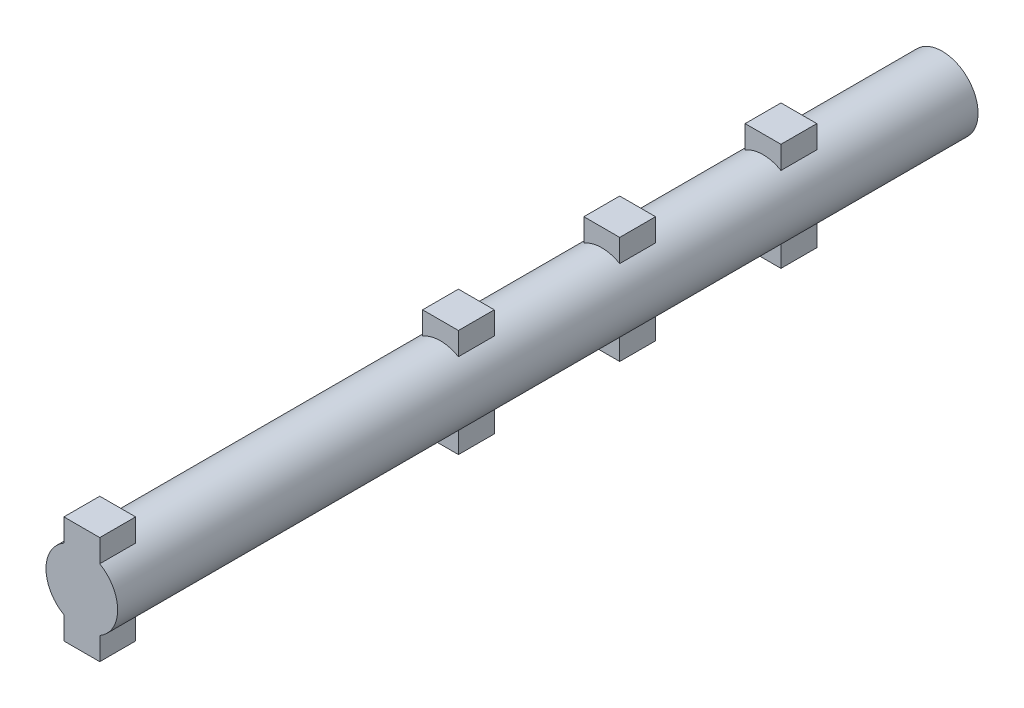
ISO-10303-21;
HEADER;
FILE_DESCRIPTION(('STEP AP214'),'2;1');
FILE_NAME('part.step','',(''),(''),'','','');
FILE_SCHEMA(('AUTOMOTIVE_DESIGN { 1 0 10303 214 1 1 1 1 }'));
ENDSEC;
DATA;
#1=APPLICATION_CONTEXT('core data for automotive mechanical design processes');
#2=APPLICATION_PROTOCOL_DEFINITION('international standard','automotive_design',2000,#1);
#3=PRODUCT_CONTEXT('',#1,'mechanical');
#4=PRODUCT('Part','Part','',(#3));
#5=PRODUCT_RELATED_PRODUCT_CATEGORY('part','',(#4));
#6=PRODUCT_DEFINITION_FORMATION('','',#4);
#7=PRODUCT_DEFINITION_CONTEXT('part definition',#1,'design');
#8=PRODUCT_DEFINITION('design','',#6,#7);
#9=PRODUCT_DEFINITION_SHAPE('','',#8);
#10=(LENGTH_UNIT() NAMED_UNIT(*) SI_UNIT(.MILLI.,.METRE.));
#11=(NAMED_UNIT(*) PLANE_ANGLE_UNIT() SI_UNIT($,.RADIAN.));
#12=(NAMED_UNIT(*) SI_UNIT($,.STERADIAN.) SOLID_ANGLE_UNIT());
#13=UNCERTAINTY_MEASURE_WITH_UNIT(LENGTH_MEASURE(1.E-05),#10,'distance_accuracy_value','');
#14=(GEOMETRIC_REPRESENTATION_CONTEXT(3) GLOBAL_UNCERTAINTY_ASSIGNED_CONTEXT((#13)) GLOBAL_UNIT_ASSIGNED_CONTEXT((#10,
#11,#12)) REPRESENTATION_CONTEXT('',''));
#15=CARTESIAN_POINT('',(0.,0.,0.));
#16=DIRECTION('',(0.,0.,1.));
#17=DIRECTION('',(1.,0.,0.));
#18=AXIS2_PLACEMENT_3D('',#15,#16,#17);
#19=CARTESIAN_POINT('',(0.,0.,25.));
#20=DIRECTION('',(0.,0.,1.));
#21=DIRECTION('',(1.,0.,0.));
#22=AXIS2_PLACEMENT_3D('',#19,#20,#21);
#23=PLANE('',#22);
#24=CARTESIAN_POINT('',(0.,0.,25.));
#25=DIRECTION('',(0.,0.,1.));
#26=DIRECTION('',(1.,0.,0.));
#27=AXIS2_PLACEMENT_3D('',#24,#25,#26);
#28=CIRCLE('',#27,5.);
#29=CARTESIAN_POINT('',(2.5,4.33012701892219,25.));
#30=VERTEX_POINT('',#29);
#31=CARTESIAN_POINT('',(-2.5,4.33012701892219,25.));
#32=VERTEX_POINT('',#31);
#33=EDGE_CURVE('E325',#30,#32,#28,.T.);
#34=ORIENTED_EDGE('',*,*,#33,.F.);
#35=DIRECTION('',(0.,1.,0.));
#36=VECTOR('',#35,1.);
#37=CARTESIAN_POINT('',(2.5,-7.5,25.));
#38=LINE('',#37,#36);
#39=CARTESIAN_POINT('',(2.5,7.5,25.));
#40=VERTEX_POINT('',#39);
#41=EDGE_CURVE('E476',#30,#40,#38,.T.);
#42=ORIENTED_EDGE('',*,*,#41,.T.);
#43=DIRECTION('',(-1.,0.,0.));
#44=VECTOR('',#43,1.);
#45=CARTESIAN_POINT('',(-2.5,7.5,25.));
#46=LINE('',#45,#44);
#47=CARTESIAN_POINT('',(-2.5,7.5,25.));
#48=VERTEX_POINT('',#47);
#49=EDGE_CURVE('E499',#40,#48,#46,.T.);
#50=ORIENTED_EDGE('',*,*,#49,.T.);
#51=DIRECTION('',(0.,-1.,0.));
#52=VECTOR('',#51,1.);
#53=CARTESIAN_POINT('',(-2.5,-7.5,25.));
#54=LINE('',#53,#52);
#55=EDGE_CURVE('E504',#48,#32,#54,.T.);
#56=ORIENTED_EDGE('',*,*,#55,.T.);
#57=EDGE_LOOP('',(#34,#42,#50,#56));
#58=FACE_BOUND('',#57,.T.);
#59=ADVANCED_FACE('F40',(#58),#23,.T.);
#60=CARTESIAN_POINT('',(0.,0.,-25.));
#61=DIRECTION('',(0.,0.,-1.));
#62=DIRECTION('',(-1.,0.,0.));
#63=AXIS2_PLACEMENT_3D('',#60,#61,#62);
#64=PLANE('',#63);
#65=CARTESIAN_POINT('',(0.,0.,-25.));
#66=DIRECTION('',(0.,0.,-1.));
#67=DIRECTION('',(-1.,0.,0.));
#68=AXIS2_PLACEMENT_3D('',#65,#66,#67);
#69=CIRCLE('',#68,5.);
#70=CARTESIAN_POINT('',(-2.5,4.33012701892219,-25.));
#71=VERTEX_POINT('',#70);
#72=CARTESIAN_POINT('',(2.5,4.33012701892219,-25.));
#73=VERTEX_POINT('',#72);
#74=EDGE_CURVE('E339',#71,#73,#69,.T.);
#75=ORIENTED_EDGE('',*,*,#74,.F.);
#76=DIRECTION('',(0.,1.,0.));
#77=VECTOR('',#76,1.);
#78=CARTESIAN_POINT('',(-2.5,-7.5,-25.));
#79=LINE('',#78,#77);
#80=CARTESIAN_POINT('',(-2.5,7.5,-25.));
#81=VERTEX_POINT('',#80);
#82=EDGE_CURVE('E378',#71,#81,#79,.T.);
#83=ORIENTED_EDGE('',*,*,#82,.T.);
#84=DIRECTION('',(1.,0.,0.));
#85=VECTOR('',#84,1.);
#86=CARTESIAN_POINT('',(-2.5,7.5,-25.));
#87=LINE('',#86,#85);
#88=CARTESIAN_POINT('',(2.5,7.5,-25.));
#89=VERTEX_POINT('',#88);
#90=EDGE_CURVE('E382',#81,#89,#87,.T.);
#91=ORIENTED_EDGE('',*,*,#90,.T.);
#92=DIRECTION('',(0.,-1.,0.));
#93=VECTOR('',#92,1.);
#94=CARTESIAN_POINT('',(2.5,-7.5,-25.));
#95=LINE('',#94,#93);
#96=EDGE_CURVE('E371',#89,#73,#95,.T.);
#97=ORIENTED_EDGE('',*,*,#96,.T.);
#98=EDGE_LOOP('',(#75,#83,#91,#97));
#99=FACE_BOUND('',#98,.T.);
#100=ADVANCED_FACE('F617',(#99),#64,.T.);
#101=CARTESIAN_POINT('',(2.5,-7.5,2.5));
#102=DIRECTION('',(1.,0.,0.));
#103=DIRECTION('',(0.,0.,-1.));
#104=AXIS2_PLACEMENT_3D('',#101,#102,#103);
#105=PLANE('',#104);
#106=DIRECTION('',(0.,0.,-1.));
#107=VECTOR('',#106,1.);
#108=CARTESIAN_POINT('',(2.5,4.33012701892219,25.));
#109=LINE('',#108,#107);
#110=CARTESIAN_POINT('',(2.5,4.33012701892219,-2.5));
#111=VERTEX_POINT('',#110);
#112=CARTESIAN_POINT('',(2.5,4.33012701892219,2.5));
#113=VERTEX_POINT('',#112);
#114=EDGE_CURVE('E454',#111,#113,#109,.F.);
#115=ORIENTED_EDGE('',*,*,#114,.F.);
#116=DIRECTION('',(0.,-1.,0.));
#117=VECTOR('',#116,1.);
#118=CARTESIAN_POINT('',(2.5,-7.5,-2.5));
#119=LINE('',#118,#117);
#120=CARTESIAN_POINT('',(2.5,7.5,-2.5));
#121=VERTEX_POINT('',#120);
#122=EDGE_CURVE('E424',#121,#111,#119,.T.);
#123=ORIENTED_EDGE('',*,*,#122,.F.);
#124=DIRECTION('',(0.,0.,-1.));
#125=VECTOR('',#124,1.);
#126=CARTESIAN_POINT('',(2.5,7.5,2.5));
#127=LINE('',#126,#125);
#128=CARTESIAN_POINT('',(2.5,7.5,2.5));
#129=VERTEX_POINT('',#128);
#130=EDGE_CURVE('E459',#129,#121,#127,.T.);
#131=ORIENTED_EDGE('',*,*,#130,.F.);
#132=DIRECTION('',(0.,-1.,0.));
#133=VECTOR('',#132,1.);
#134=CARTESIAN_POINT('',(2.5,-7.5,2.5));
#135=LINE('',#134,#133);
#136=EDGE_CURVE('E442',#129,#113,#135,.T.);
#137=ORIENTED_EDGE('',*,*,#136,.T.);
#138=EDGE_LOOP('',(#115,#123,#131,#137));
#139=FACE_BOUND('',#138,.T.);
#140=ADVANCED_FACE('F623',(#139),#105,.T.);
#141=CARTESIAN_POINT('',(2.5,-4.33012701892219,-2.5));
#142=VERTEX_POINT('',#141);
#143=CARTESIAN_POINT('',(2.5,-7.5,-2.5));
#144=VERTEX_POINT('',#143);
#145=EDGE_CURVE('E423',#142,#144,#119,.T.);
#146=ORIENTED_EDGE('',*,*,#145,.F.);
#147=DIRECTION('',(0.,0.,-1.));
#148=VECTOR('',#147,1.);
#149=CARTESIAN_POINT('',(2.5,-4.33012701892219,25.));
#150=LINE('',#149,#148);
#151=CARTESIAN_POINT('',(2.5,-4.33012701892219,2.5));
#152=VERTEX_POINT('',#151);
#153=EDGE_CURVE('E467',#152,#142,#150,.T.);
#154=ORIENTED_EDGE('',*,*,#153,.F.);
#155=CARTESIAN_POINT('',(2.5,-7.5,2.5));
#156=VERTEX_POINT('',#155);
#157=EDGE_CURVE('E441',#152,#156,#135,.T.);
#158=ORIENTED_EDGE('',*,*,#157,.T.);
#159=DIRECTION('',(0.,0.,-1.));
#160=VECTOR('',#159,1.);
#161=CARTESIAN_POINT('',(2.5,-7.5,2.5));
#162=LINE('',#161,#160);
#163=EDGE_CURVE('E455',#156,#144,#162,.T.);
#164=ORIENTED_EDGE('',*,*,#163,.T.);
#165=EDGE_LOOP('',(#146,#154,#158,#164));
#166=FACE_BOUND('',#165,.T.);
#167=ADVANCED_FACE('F572',(#166),#105,.T.);
#168=CARTESIAN_POINT('',(-2.5,-7.5,2.5));
#169=DIRECTION('',(-1.,0.,0.));
#170=DIRECTION('',(0.,0.,1.));
#171=AXIS2_PLACEMENT_3D('',#168,#169,#170);
#172=PLANE('',#171);
#173=DIRECTION('',(0.,0.,-1.));
#174=VECTOR('',#173,1.);
#175=CARTESIAN_POINT('',(-2.5,-4.33012701892219,25.));
#176=LINE('',#175,#174);
#177=CARTESIAN_POINT('',(-2.5,-4.33012701892219,-2.5));
#178=VERTEX_POINT('',#177);
#179=CARTESIAN_POINT('',(-2.5,-4.33012701892219,2.5));
#180=VERTEX_POINT('',#179);
#181=EDGE_CURVE('E470',#178,#180,#176,.F.);
#182=ORIENTED_EDGE('',*,*,#181,.F.);
#183=DIRECTION('',(0.,1.,0.));
#184=VECTOR('',#183,1.);
#185=CARTESIAN_POINT('',(-2.5,-7.5,-2.5));
#186=LINE('',#185,#184);
#187=CARTESIAN_POINT('',(-2.5,-7.5,-2.5));
#188=VERTEX_POINT('',#187);
#189=EDGE_CURVE('E415',#188,#178,#186,.T.);
#190=ORIENTED_EDGE('',*,*,#189,.F.);
#191=DIRECTION('',(0.,0.,-1.));
#192=VECTOR('',#191,1.);
#193=CARTESIAN_POINT('',(-2.5,-7.5,2.5));
#194=LINE('',#193,#192);
#195=CARTESIAN_POINT('',(-2.5,-7.5,2.5));
#196=VERTEX_POINT('',#195);
#197=EDGE_CURVE('E451',#196,#188,#194,.T.);
#198=ORIENTED_EDGE('',*,*,#197,.F.);
#199=DIRECTION('',(0.,1.,0.));
#200=VECTOR('',#199,1.);
#201=CARTESIAN_POINT('',(-2.5,-7.5,2.5));
#202=LINE('',#201,#200);
#203=EDGE_CURVE('E433',#196,#180,#202,.T.);
#204=ORIENTED_EDGE('',*,*,#203,.T.);
#205=EDGE_LOOP('',(#182,#190,#198,#204));
#206=FACE_BOUND('',#205,.T.);
#207=ADVANCED_FACE('F724',(#206),#172,.T.);
#208=CARTESIAN_POINT('',(-2.5,4.33012701892219,-2.5));
#209=VERTEX_POINT('',#208);
#210=CARTESIAN_POINT('',(-2.5,7.5,-2.5));
#211=VERTEX_POINT('',#210);
#212=EDGE_CURVE('E414',#209,#211,#186,.T.);
#213=ORIENTED_EDGE('',*,*,#212,.F.);
#214=DIRECTION('',(0.,0.,-1.));
#215=VECTOR('',#214,1.);
#216=CARTESIAN_POINT('',(-2.5,4.33012701892219,25.));
#217=LINE('',#216,#215);
#218=CARTESIAN_POINT('',(-2.5,4.33012701892219,2.5));
#219=VERTEX_POINT('',#218);
#220=EDGE_CURVE('E473',#219,#209,#217,.T.);
#221=ORIENTED_EDGE('',*,*,#220,.F.);
#222=CARTESIAN_POINT('',(-2.5,7.5,2.5));
#223=VERTEX_POINT('',#222);
#224=EDGE_CURVE('E432',#219,#223,#202,.T.);
#225=ORIENTED_EDGE('',*,*,#224,.T.);
#226=DIRECTION('',(0.,0.,-1.));
#227=VECTOR('',#226,1.);
#228=CARTESIAN_POINT('',(-2.5,7.5,2.5));
#229=LINE('',#228,#227);
#230=EDGE_CURVE('E450',#223,#211,#229,.T.);
#231=ORIENTED_EDGE('',*,*,#230,.T.);
#232=EDGE_LOOP('',(#213,#221,#225,#231));
#233=FACE_BOUND('',#232,.T.);
#234=ADVANCED_FACE('F695',(#233),#172,.T.);
#235=CARTESIAN_POINT('',(0.,0.,-2.5));
#236=DIRECTION('',(0.,0.,1.));
#237=DIRECTION('',(1.,0.,0.));
#238=AXIS2_PLACEMENT_3D('',#235,#236,#237);
#239=PLANE('',#238);
#240=CARTESIAN_POINT('',(0.,0.,-2.5));
#241=DIRECTION('',(0.,0.,1.));
#242=DIRECTION('',(1.,0.,0.));
#243=AXIS2_PLACEMENT_3D('',#240,#241,#242);
#244=CIRCLE('',#243,5.);
#245=EDGE_CURVE('E551',#142,#178,#244,.F.);
#246=ORIENTED_EDGE('',*,*,#245,.F.);
#247=ORIENTED_EDGE('',*,*,#145,.T.);
#248=DIRECTION('',(-1.,0.,0.));
#249=VECTOR('',#248,1.);
#250=CARTESIAN_POINT('',(2.5,-7.5,-2.5));
#251=LINE('',#250,#249);
#252=EDGE_CURVE('E428',#144,#188,#251,.T.);
#253=ORIENTED_EDGE('',*,*,#252,.T.);
#254=ORIENTED_EDGE('',*,*,#189,.T.);
#255=EDGE_LOOP('',(#246,#247,#253,#254));
#256=FACE_BOUND('',#255,.T.);
#257=ADVANCED_FACE('F569',(#256),#239,.F.);
#258=CARTESIAN_POINT('',(0.,0.,25.));
#259=DIRECTION('',(0.,0.,-1.));
#260=DIRECTION('',(-1.,0.,0.));
#261=AXIS2_PLACEMENT_3D('',#258,#259,#260);
#262=CYLINDRICAL_SURFACE('',#261,5.);
#263=CARTESIAN_POINT('',(0.,0.,70.0439507198228));
#264=DIRECTION('',(0.,0.,1.));
#265=DIRECTION('',(1.,0.,0.));
#266=AXIS2_PLACEMENT_3D('',#263,#264,#265);
#267=CIRCLE('',#266,5.);
#268=CARTESIAN_POINT('',(2.5,4.33012701892219,70.0439507198228));
#269=VERTEX_POINT('',#268);
#270=CARTESIAN_POINT('',(-2.5,4.33012701892219,70.0439507198228));
#271=VERTEX_POINT('',#270);
#272=EDGE_CURVE('E11',#269,#271,#267,.T.);
#273=ORIENTED_EDGE('',*,*,#272,.F.);
#274=DIRECTION('',(0.,0.,-1.));
#275=VECTOR('',#274,1.);
#276=CARTESIAN_POINT('',(2.5,4.33012701892219,25.));
#277=LINE('',#276,#275);
#278=CARTESIAN_POINT('',(2.5,4.3301270189222,75.0439507198228));
#279=VERTEX_POINT('',#278);
#280=EDGE_CURVE('E259',#269,#279,#277,.F.);
#281=ORIENTED_EDGE('',*,*,#280,.T.);
#282=CARTESIAN_POINT('',(0.,0.,75.0439507198228));
#283=DIRECTION('',(0.,0.,1.));
#284=DIRECTION('',(1.,0.,0.));
#285=AXIS2_PLACEMENT_3D('',#282,#283,#284);
#286=CIRCLE('',#285,5.);
#287=CARTESIAN_POINT('',(2.5,-4.3301270189222,75.0439507198228));
#288=VERTEX_POINT('',#287);
#289=EDGE_CURVE('E326',#288,#279,#286,.T.);
#290=ORIENTED_EDGE('',*,*,#289,.F.);
#291=DIRECTION('',(0.,0.,-1.));
#292=VECTOR('',#291,1.);
#293=CARTESIAN_POINT('',(2.5,-4.33012701892219,25.));
#294=LINE('',#293,#292);
#295=CARTESIAN_POINT('',(2.5,-4.33012701892219,70.0439507198228));
#296=VERTEX_POINT('',#295);
#297=EDGE_CURVE('E321',#288,#296,#294,.T.);
#298=ORIENTED_EDGE('',*,*,#297,.T.);
#299=CARTESIAN_POINT('',(-2.5,-4.33012701892219,70.0439507198228));
#300=VERTEX_POINT('',#299);
#301=EDGE_CURVE('E44',#300,#296,#267,.T.);
#302=ORIENTED_EDGE('',*,*,#301,.F.);
#303=DIRECTION('',(0.,0.,-1.));
#304=VECTOR('',#303,1.);
#305=CARTESIAN_POINT('',(-2.5,-4.33012701892219,25.));
#306=LINE('',#305,#304);
#307=CARTESIAN_POINT('',(-2.5,-4.3301270189222,75.0439507198228));
#308=VERTEX_POINT('',#307);
#309=EDGE_CURVE('E305',#300,#308,#306,.F.);
#310=ORIENTED_EDGE('',*,*,#309,.T.);
#311=CARTESIAN_POINT('',(-2.5,4.3301270189222,75.0439507198228));
#312=VERTEX_POINT('',#311);
#313=EDGE_CURVE('E329',#312,#308,#286,.T.);
#314=ORIENTED_EDGE('',*,*,#313,.F.);
#315=DIRECTION('',(0.,0.,-1.));
#316=VECTOR('',#315,1.);
#317=CARTESIAN_POINT('',(-2.5,4.33012701892219,25.));
#318=LINE('',#317,#316);
#319=EDGE_CURVE('E315',#312,#271,#318,.T.);
#320=ORIENTED_EDGE('',*,*,#319,.T.);
#321=EDGE_LOOP('',(#273,#281,#290,#298,#302,#310,#314,#320));
#322=FACE_BOUND('',#321,.T.);
#323=DIRECTION('',(0.,0.,-1.));
#324=VECTOR('',#323,1.);
#325=CARTESIAN_POINT('',(-2.5,-4.33012701892219,25.));
#326=LINE('',#325,#324);
#327=CARTESIAN_POINT('',(-2.5,-4.33012701892219,20.));
#328=VERTEX_POINT('',#327);
#329=CARTESIAN_POINT('',(-2.5,-4.33012701892219,25.));
#330=VERTEX_POINT('',#329);
#331=EDGE_CURVE('E514',#328,#330,#326,.F.);
#332=ORIENTED_EDGE('',*,*,#331,.T.);
#333=CARTESIAN_POINT('',(2.5,-4.33012701892219,25.));
#334=VERTEX_POINT('',#333);
#335=EDGE_CURVE('E333',#330,#334,#28,.T.);
#336=ORIENTED_EDGE('',*,*,#335,.T.);
#337=DIRECTION('',(0.,0.,-1.));
#338=VECTOR('',#337,1.);
#339=CARTESIAN_POINT('',(2.5,-4.33012701892219,25.));
#340=LINE('',#339,#338);
#341=CARTESIAN_POINT('',(2.5,-4.33012701892219,20.));
#342=VERTEX_POINT('',#341);
#343=EDGE_CURVE('E535',#334,#342,#340,.T.);
#344=ORIENTED_EDGE('',*,*,#343,.T.);
#345=CARTESIAN_POINT('',(0.,0.,20.));
#346=DIRECTION('',(0.,0.,-1.));
#347=DIRECTION('',(-1.,0.,0.));
#348=AXIS2_PLACEMENT_3D('',#345,#346,#347);
#349=CIRCLE('',#348,5.);
#350=EDGE_CURVE('E539',#342,#328,#349,.T.);
#351=ORIENTED_EDGE('',*,*,#350,.T.);
#352=EDGE_LOOP('',(#332,#336,#344,#351));
#353=FACE_BOUND('',#352,.T.);
#354=DIRECTION('',(0.,0.,-1.));
#355=VECTOR('',#354,1.);
#356=CARTESIAN_POINT('',(2.5,-4.33012701892219,25.));
#357=LINE('',#356,#355);
#358=CARTESIAN_POINT('',(2.5,-4.33012701892219,-20.));
#359=VERTEX_POINT('',#358);
#360=CARTESIAN_POINT('',(2.5,-4.33012701892219,-25.));
#361=VERTEX_POINT('',#360);
#362=EDGE_CURVE('E410',#359,#361,#357,.T.);
#363=ORIENTED_EDGE('',*,*,#362,.T.);
#364=CARTESIAN_POINT('',(-2.5,-4.33012701892219,-25.));
#365=VERTEX_POINT('',#364);
#366=EDGE_CURVE('E344',#361,#365,#69,.T.);
#367=ORIENTED_EDGE('',*,*,#366,.T.);
#368=DIRECTION('',(0.,0.,-1.));
#369=VECTOR('',#368,1.);
#370=CARTESIAN_POINT('',(-2.5,-4.33012701892219,25.));
#371=LINE('',#370,#369);
#372=CARTESIAN_POINT('',(-2.5,-4.33012701892219,-20.));
#373=VERTEX_POINT('',#372);
#374=EDGE_CURVE('E389',#365,#373,#371,.F.);
#375=ORIENTED_EDGE('',*,*,#374,.T.);
#376=CARTESIAN_POINT('',(0.,0.,-20.));
#377=DIRECTION('',(0.,0.,-1.));
#378=DIRECTION('',(-1.,0.,0.));
#379=AXIS2_PLACEMENT_3D('',#376,#377,#378);
#380=CIRCLE('',#379,5.);
#381=EDGE_CURVE('E552',#359,#373,#380,.T.);
#382=ORIENTED_EDGE('',*,*,#381,.F.);
#383=EDGE_LOOP('',(#363,#367,#375,#382));
#384=FACE_BOUND('',#383,.T.);
#385=ORIENTED_EDGE('',*,*,#74,.T.);
#386=DIRECTION('',(0.,0.,-1.));
#387=VECTOR('',#386,1.);
#388=CARTESIAN_POINT('',(2.5,4.33012701892219,25.));
#389=LINE('',#388,#387);
#390=CARTESIAN_POINT('',(2.5,4.33012701892219,-20.));
#391=VERTEX_POINT('',#390);
#392=EDGE_CURVE('E406',#73,#391,#389,.F.);
#393=ORIENTED_EDGE('',*,*,#392,.T.);
#394=CARTESIAN_POINT('',(-2.5,4.33012701892219,-20.));
#395=VERTEX_POINT('',#394);
#396=EDGE_CURVE('E554',#395,#391,#380,.T.);
#397=ORIENTED_EDGE('',*,*,#396,.F.);
#398=DIRECTION('',(0.,0.,-1.));
#399=VECTOR('',#398,1.);
#400=CARTESIAN_POINT('',(-2.5,4.33012701892219,25.));
#401=LINE('',#400,#399);
#402=EDGE_CURVE('E403',#395,#71,#401,.T.);
#403=ORIENTED_EDGE('',*,*,#402,.T.);
#404=EDGE_LOOP('',(#385,#393,#397,#403));
#405=FACE_BOUND('',#404,.T.);
#406=EDGE_CURVE('E548',#209,#111,#244,.F.);
#407=ORIENTED_EDGE('',*,*,#406,.T.);
#408=ORIENTED_EDGE('',*,*,#114,.T.);
#409=CARTESIAN_POINT('',(0.,0.,2.5));
#410=DIRECTION('',(0.,0.,1.));
#411=DIRECTION('',(1.,0.,0.));
#412=AXIS2_PLACEMENT_3D('',#409,#410,#411);
#413=CIRCLE('',#412,5.);
#414=EDGE_CURVE('E547',#113,#219,#413,.T.);
#415=ORIENTED_EDGE('',*,*,#414,.T.);
#416=ORIENTED_EDGE('',*,*,#220,.T.);
#417=EDGE_LOOP('',(#407,#408,#415,#416));
#418=FACE_BOUND('',#417,.T.);
#419=ORIENTED_EDGE('',*,*,#153,.T.);
#420=ORIENTED_EDGE('',*,*,#245,.T.);
#421=ORIENTED_EDGE('',*,*,#181,.T.);
#422=EDGE_CURVE('E544',#180,#152,#413,.T.);
#423=ORIENTED_EDGE('',*,*,#422,.T.);
#424=EDGE_LOOP('',(#419,#420,#421,#423));
#425=FACE_BOUND('',#424,.T.);
#426=CARTESIAN_POINT('',(-2.5,4.33012701892219,20.));
#427=VERTEX_POINT('',#426);
#428=CARTESIAN_POINT('',(2.5,4.33012701892219,20.));
#429=VERTEX_POINT('',#428);
#430=EDGE_CURVE('E543',#427,#429,#349,.T.);
#431=ORIENTED_EDGE('',*,*,#430,.T.);
#432=DIRECTION('',(0.,0.,-1.));
#433=VECTOR('',#432,1.);
#434=CARTESIAN_POINT('',(2.5,4.33012701892219,25.));
#435=LINE('',#434,#433);
#436=EDGE_CURVE('E532',#429,#30,#435,.F.);
#437=ORIENTED_EDGE('',*,*,#436,.T.);
#438=ORIENTED_EDGE('',*,*,#33,.T.);
#439=DIRECTION('',(0.,0.,-1.));
#440=VECTOR('',#439,1.);
#441=CARTESIAN_POINT('',(-2.5,4.33012701892219,25.));
#442=LINE('',#441,#440);
#443=EDGE_CURVE('E528',#32,#427,#442,.T.);
#444=ORIENTED_EDGE('',*,*,#443,.T.);
#445=EDGE_LOOP('',(#431,#437,#438,#444));
#446=FACE_BOUND('',#445,.T.);
#447=CARTESIAN_POINT('',(0.,0.,-45.));
#448=DIRECTION('',(0.,0.,-1.));
#449=DIRECTION('',(-1.,0.,0.));
#450=AXIS2_PLACEMENT_3D('',#447,#448,#449);
#451=CIRCLE('',#450,5.);
#452=CARTESIAN_POINT('',(-5.,0.,-45.));
#453=VERTEX_POINT('',#452);
#454=EDGE_CURVE('E334',#453,#453,#451,.T.);
#455=ORIENTED_EDGE('',*,*,#454,.F.);
#456=EDGE_LOOP('',(#455));
#457=FACE_BOUND('',#456,.T.);
#458=ADVANCED_FACE('F42',(#322,#353,#384,#405,#418,#425,#446,#457),#262,.T.);
#459=ORIENTED_EDGE('',*,*,#335,.F.);
#460=CARTESIAN_POINT('',(-2.5,-7.5,25.));
#461=VERTEX_POINT('',#460);
#462=EDGE_CURVE('E503',#330,#461,#54,.T.);
#463=ORIENTED_EDGE('',*,*,#462,.T.);
#464=DIRECTION('',(1.,0.,0.));
#465=VECTOR('',#464,1.);
#466=CARTESIAN_POINT('',(-2.5,-7.5,25.));
#467=LINE('',#466,#465);
#468=CARTESIAN_POINT('',(2.5,-7.5,25.));
#469=VERTEX_POINT('',#468);
#470=EDGE_CURVE('E507',#461,#469,#467,.T.);
#471=ORIENTED_EDGE('',*,*,#470,.T.);
#472=EDGE_CURVE('E496',#469,#334,#38,.T.);
#473=ORIENTED_EDGE('',*,*,#472,.T.);
#474=EDGE_LOOP('',(#459,#463,#471,#473));
#475=FACE_BOUND('',#474,.T.);
#476=ADVANCED_FACE('F619',(#475),#23,.T.);
#477=CARTESIAN_POINT('',(-2.5,-7.5,20.));
#478=DIRECTION('',(0.,-1.,0.));
#479=DIRECTION('',(0.,0.,-1.));
#480=AXIS2_PLACEMENT_3D('',#477,#478,#479);
#481=PLANE('',#480);
#482=ORIENTED_EDGE('',*,*,#470,.F.);
#483=DIRECTION('',(0.,0.,1.));
#484=VECTOR('',#483,1.);
#485=CARTESIAN_POINT('',(-2.5,-7.5,20.));
#486=LINE('',#485,#484);
#487=CARTESIAN_POINT('',(-2.5,-7.5,20.));
#488=VERTEX_POINT('',#487);
#489=EDGE_CURVE('E515',#488,#461,#486,.T.);
#490=ORIENTED_EDGE('',*,*,#489,.F.);
#491=DIRECTION('',(1.,0.,0.));
#492=VECTOR('',#491,1.);
#493=CARTESIAN_POINT('',(-2.5,-7.5,20.));
#494=LINE('',#493,#492);
#495=CARTESIAN_POINT('',(2.5,-7.5,20.));
#496=VERTEX_POINT('',#495);
#497=EDGE_CURVE('E491',#488,#496,#494,.T.);
#498=ORIENTED_EDGE('',*,*,#497,.T.);
#499=DIRECTION('',(0.,0.,1.));
#500=VECTOR('',#499,1.);
#501=CARTESIAN_POINT('',(2.5,-7.5,20.));
#502=LINE('',#501,#500);
#503=EDGE_CURVE('E511',#496,#469,#502,.T.);
#504=ORIENTED_EDGE('',*,*,#503,.T.);
#505=EDGE_LOOP('',(#482,#490,#498,#504));
#506=FACE_BOUND('',#505,.T.);
#507=ADVANCED_FACE('F630',(#506),#481,.T.);
#508=CARTESIAN_POINT('',(0.,0.,20.));
#509=DIRECTION('',(0.,0.,-1.));
#510=DIRECTION('',(-1.,0.,0.));
#511=AXIS2_PLACEMENT_3D('',#508,#509,#510);
#512=PLANE('',#511);
#513=ORIENTED_EDGE('',*,*,#350,.F.);
#514=DIRECTION('',(0.,1.,0.));
#515=VECTOR('',#514,1.);
#516=CARTESIAN_POINT('',(2.5,-7.5,20.));
#517=LINE('',#516,#515);
#518=EDGE_CURVE('E477',#496,#342,#517,.T.);
#519=ORIENTED_EDGE('',*,*,#518,.F.);
#520=ORIENTED_EDGE('',*,*,#497,.F.);
#521=DIRECTION('',(0.,-1.,0.));
#522=VECTOR('',#521,1.);
#523=CARTESIAN_POINT('',(-2.5,-7.5,20.));
#524=LINE('',#523,#522);
#525=EDGE_CURVE('E486',#328,#488,#524,.T.);
#526=ORIENTED_EDGE('',*,*,#525,.F.);
#527=EDGE_LOOP('',(#513,#519,#520,#526));
#528=FACE_BOUND('',#527,.T.);
#529=ADVANCED_FACE('F636',(#528),#512,.T.);
#530=CARTESIAN_POINT('',(-2.5,-7.5,20.));
#531=DIRECTION('',(-1.,0.,0.));
#532=DIRECTION('',(0.,0.,1.));
#533=AXIS2_PLACEMENT_3D('',#530,#531,#532);
#534=PLANE('',#533);
#535=ORIENTED_EDGE('',*,*,#331,.F.);
#536=ORIENTED_EDGE('',*,*,#525,.T.);
#537=ORIENTED_EDGE('',*,*,#489,.T.);
#538=ORIENTED_EDGE('',*,*,#462,.F.);
#539=EDGE_LOOP('',(#535,#536,#537,#538));
#540=FACE_BOUND('',#539,.T.);
#541=ADVANCED_FACE('F645',(#540),#534,.T.);
#542=CARTESIAN_POINT('',(2.5,-7.5,20.));
#543=DIRECTION('',(1.,0.,0.));
#544=DIRECTION('',(0.,0.,-1.));
#545=AXIS2_PLACEMENT_3D('',#542,#543,#544);
#546=PLANE('',#545);
#547=ORIENTED_EDGE('',*,*,#343,.F.);
#548=ORIENTED_EDGE('',*,*,#472,.F.);
#549=ORIENTED_EDGE('',*,*,#503,.F.);
#550=ORIENTED_EDGE('',*,*,#518,.T.);
#551=EDGE_LOOP('',(#547,#548,#549,#550));
#552=FACE_BOUND('',#551,.T.);
#553=ADVANCED_FACE('F655',(#552),#546,.T.);
#554=ORIENTED_EDGE('',*,*,#430,.F.);
#555=CARTESIAN_POINT('',(-2.5,7.5,20.));
#556=VERTEX_POINT('',#555);
#557=EDGE_CURVE('E487',#556,#427,#524,.T.);
#558=ORIENTED_EDGE('',*,*,#557,.F.);
#559=DIRECTION('',(-1.,0.,0.));
#560=VECTOR('',#559,1.);
#561=CARTESIAN_POINT('',(-2.5,7.5,20.));
#562=LINE('',#561,#560);
#563=CARTESIAN_POINT('',(2.5,7.5,20.));
#564=VERTEX_POINT('',#563);
#565=EDGE_CURVE('E481',#564,#556,#562,.T.);
#566=ORIENTED_EDGE('',*,*,#565,.F.);
#567=EDGE_CURVE('E482',#429,#564,#517,.T.);
#568=ORIENTED_EDGE('',*,*,#567,.F.);
#569=EDGE_LOOP('',(#554,#558,#566,#568));
#570=FACE_BOUND('',#569,.T.);
#571=ADVANCED_FACE('F657',(#570),#512,.T.);
#572=ORIENTED_EDGE('',*,*,#436,.F.);
#573=ORIENTED_EDGE('',*,*,#567,.T.);
#574=DIRECTION('',(0.,0.,1.));
#575=VECTOR('',#574,1.);
#576=CARTESIAN_POINT('',(2.5,7.5,20.));
#577=LINE('',#576,#575);
#578=EDGE_CURVE('E495',#564,#40,#577,.T.);
#579=ORIENTED_EDGE('',*,*,#578,.T.);
#580=ORIENTED_EDGE('',*,*,#41,.F.);
#581=EDGE_LOOP('',(#572,#573,#579,#580));
#582=FACE_BOUND('',#581,.T.);
#583=ADVANCED_FACE('F658',(#582),#546,.T.);
#584=ORIENTED_EDGE('',*,*,#443,.F.);
#585=ORIENTED_EDGE('',*,*,#55,.F.);
#586=DIRECTION('',(0.,0.,1.));
#587=VECTOR('',#586,1.);
#588=CARTESIAN_POINT('',(-2.5,7.5,20.));
#589=LINE('',#588,#587);
#590=EDGE_CURVE('E519',#556,#48,#589,.T.);
#591=ORIENTED_EDGE('',*,*,#590,.F.);
#592=ORIENTED_EDGE('',*,*,#557,.T.);
#593=EDGE_LOOP('',(#584,#585,#591,#592));
#594=FACE_BOUND('',#593,.T.);
#595=ADVANCED_FACE('F666',(#594),#534,.T.);
#596=CARTESIAN_POINT('',(-2.5,7.5,20.));
#597=DIRECTION('',(0.,1.,0.));
#598=DIRECTION('',(0.,0.,1.));
#599=AXIS2_PLACEMENT_3D('',#596,#597,#598);
#600=PLANE('',#599);
#601=ORIENTED_EDGE('',*,*,#49,.F.);
#602=ORIENTED_EDGE('',*,*,#578,.F.);
#603=ORIENTED_EDGE('',*,*,#565,.T.);
#604=ORIENTED_EDGE('',*,*,#590,.T.);
#605=EDGE_LOOP('',(#601,#602,#603,#604));
#606=FACE_BOUND('',#605,.T.);
#607=ADVANCED_FACE('F673',(#606),#600,.T.);
#608=CARTESIAN_POINT('',(2.5,-7.5,2.5));
#609=DIRECTION('',(0.,-1.,0.));
#610=DIRECTION('',(0.,0.,-1.));
#611=AXIS2_PLACEMENT_3D('',#608,#609,#610);
#612=PLANE('',#611);
#613=ORIENTED_EDGE('',*,*,#197,.T.);
#614=ORIENTED_EDGE('',*,*,#252,.F.);
#615=ORIENTED_EDGE('',*,*,#163,.F.);
#616=DIRECTION('',(-1.,0.,0.));
#617=VECTOR('',#616,1.);
#618=CARTESIAN_POINT('',(2.5,-7.5,2.5));
#619=LINE('',#618,#617);
#620=EDGE_CURVE('E446',#156,#196,#619,.T.);
#621=ORIENTED_EDGE('',*,*,#620,.T.);
#622=EDGE_LOOP('',(#613,#614,#615,#621));
#623=FACE_BOUND('',#622,.T.);
#624=ADVANCED_FACE('F733',(#623),#612,.T.);
#625=CARTESIAN_POINT('',(0.,0.,2.5));
#626=DIRECTION('',(0.,0.,1.));
#627=DIRECTION('',(1.,0.,0.));
#628=AXIS2_PLACEMENT_3D('',#625,#626,#627);
#629=PLANE('',#628);
#630=ORIENTED_EDGE('',*,*,#422,.F.);
#631=ORIENTED_EDGE('',*,*,#203,.F.);
#632=ORIENTED_EDGE('',*,*,#620,.F.);
#633=ORIENTED_EDGE('',*,*,#157,.F.);
#634=EDGE_LOOP('',(#630,#631,#632,#633));
#635=FACE_BOUND('',#634,.T.);
#636=ADVANCED_FACE('F738',(#635),#629,.T.);
#637=ORIENTED_EDGE('',*,*,#414,.F.);
#638=ORIENTED_EDGE('',*,*,#136,.F.);
#639=DIRECTION('',(1.,0.,0.));
#640=VECTOR('',#639,1.);
#641=CARTESIAN_POINT('',(2.5,7.5,2.5));
#642=LINE('',#641,#640);
#643=EDGE_CURVE('E437',#223,#129,#642,.T.);
#644=ORIENTED_EDGE('',*,*,#643,.F.);
#645=ORIENTED_EDGE('',*,*,#224,.F.);
#646=EDGE_LOOP('',(#637,#638,#644,#645));
#647=FACE_BOUND('',#646,.T.);
#648=ADVANCED_FACE('F703',(#647),#629,.T.);
#649=CARTESIAN_POINT('',(2.5,7.5,2.5));
#650=DIRECTION('',(0.,1.,0.));
#651=DIRECTION('',(0.,0.,1.));
#652=AXIS2_PLACEMENT_3D('',#649,#650,#651);
#653=PLANE('',#652);
#654=ORIENTED_EDGE('',*,*,#130,.T.);
#655=DIRECTION('',(1.,0.,0.));
#656=VECTOR('',#655,1.);
#657=CARTESIAN_POINT('',(2.5,7.5,-2.5));
#658=LINE('',#657,#656);
#659=EDGE_CURVE('E419',#211,#121,#658,.T.);
#660=ORIENTED_EDGE('',*,*,#659,.F.);
#661=ORIENTED_EDGE('',*,*,#230,.F.);
#662=ORIENTED_EDGE('',*,*,#643,.T.);
#663=EDGE_LOOP('',(#654,#660,#661,#662));
#664=FACE_BOUND('',#663,.T.);
#665=ADVANCED_FACE('F701',(#664),#653,.T.);
#666=ORIENTED_EDGE('',*,*,#406,.F.);
#667=ORIENTED_EDGE('',*,*,#212,.T.);
#668=ORIENTED_EDGE('',*,*,#659,.T.);
#669=ORIENTED_EDGE('',*,*,#122,.T.);
#670=EDGE_LOOP('',(#666,#667,#668,#669));
#671=FACE_BOUND('',#670,.T.);
#672=ADVANCED_FACE('F708',(#671),#239,.F.);
#673=ORIENTED_EDGE('',*,*,#366,.F.);
#674=CARTESIAN_POINT('',(2.5,-7.5,-25.));
#675=VERTEX_POINT('',#674);
#676=EDGE_CURVE('E351',#361,#675,#95,.T.);
#677=ORIENTED_EDGE('',*,*,#676,.T.);
#678=DIRECTION('',(-1.,0.,0.));
#679=VECTOR('',#678,1.);
#680=CARTESIAN_POINT('',(-2.5,-7.5,-25.));
#681=LINE('',#680,#679);
#682=CARTESIAN_POINT('',(-2.5,-7.5,-25.));
#683=VERTEX_POINT('',#682);
#684=EDGE_CURVE('E374',#675,#683,#681,.T.);
#685=ORIENTED_EDGE('',*,*,#684,.T.);
#686=EDGE_CURVE('E379',#683,#365,#79,.T.);
#687=ORIENTED_EDGE('',*,*,#686,.T.);
#688=EDGE_LOOP('',(#673,#677,#685,#687));
#689=FACE_BOUND('',#688,.T.);
#690=ADVANCED_FACE('F626',(#689),#64,.T.);
#691=CARTESIAN_POINT('',(-2.5,-7.5,-20.));
#692=DIRECTION('',(0.,-1.,0.));
#693=DIRECTION('',(1.,0.,0.));
#694=AXIS2_PLACEMENT_3D('',#691,#692,#693);
#695=PLANE('',#694);
#696=ORIENTED_EDGE('',*,*,#684,.F.);
#697=DIRECTION('',(0.,0.,-1.));
#698=VECTOR('',#697,1.);
#699=CARTESIAN_POINT('',(2.5,-7.5,-20.));
#700=LINE('',#699,#698);
#701=CARTESIAN_POINT('',(2.5,-7.5,-20.));
#702=VERTEX_POINT('',#701);
#703=EDGE_CURVE('E370',#702,#675,#700,.T.);
#704=ORIENTED_EDGE('',*,*,#703,.F.);
#705=DIRECTION('',(-1.,0.,0.));
#706=VECTOR('',#705,1.);
#707=CARTESIAN_POINT('',(-2.5,-7.5,-20.));
#708=LINE('',#707,#706);
#709=CARTESIAN_POINT('',(-2.5,-7.5,-20.));
#710=VERTEX_POINT('',#709);
#711=EDGE_CURVE('E356',#702,#710,#708,.T.);
#712=ORIENTED_EDGE('',*,*,#711,.T.);
#713=DIRECTION('',(0.,0.,-1.));
#714=VECTOR('',#713,1.);
#715=CARTESIAN_POINT('',(-2.5,-7.5,-20.));
#716=LINE('',#715,#714);
#717=EDGE_CURVE('E394',#710,#683,#716,.T.);
#718=ORIENTED_EDGE('',*,*,#717,.T.);
#719=EDGE_LOOP('',(#696,#704,#712,#718));
#720=FACE_BOUND('',#719,.T.);
#721=ADVANCED_FACE('F716',(#720),#695,.T.);
#722=CARTESIAN_POINT('',(0.,0.,-20.));
#723=DIRECTION('',(0.,0.,-1.));
#724=DIRECTION('',(-1.,0.,0.));
#725=AXIS2_PLACEMENT_3D('',#722,#723,#724);
#726=PLANE('',#725);
#727=DIRECTION('',(0.,-1.,0.));
#728=VECTOR('',#727,1.);
#729=CARTESIAN_POINT('',(2.5,-7.5,-20.));
#730=LINE('',#729,#728);
#731=EDGE_CURVE('E357',#359,#702,#730,.T.);
#732=ORIENTED_EDGE('',*,*,#731,.F.);
#733=ORIENTED_EDGE('',*,*,#381,.T.);
#734=DIRECTION('',(0.,1.,0.));
#735=VECTOR('',#734,1.);
#736=CARTESIAN_POINT('',(-2.5,-7.5,-20.));
#737=LINE('',#736,#735);
#738=EDGE_CURVE('E362',#710,#373,#737,.T.);
#739=ORIENTED_EDGE('',*,*,#738,.F.);
#740=ORIENTED_EDGE('',*,*,#711,.F.);
#741=EDGE_LOOP('',(#732,#733,#739,#740));
#742=FACE_BOUND('',#741,.T.);
#743=ADVANCED_FACE('F782',(#742),#726,.F.);
#744=CARTESIAN_POINT('',(-2.5,-7.5,-20.));
#745=DIRECTION('',(-1.,0.,0.));
#746=DIRECTION('',(0.,0.,1.));
#747=AXIS2_PLACEMENT_3D('',#744,#745,#746);
#748=PLANE('',#747);
#749=ORIENTED_EDGE('',*,*,#374,.F.);
#750=ORIENTED_EDGE('',*,*,#686,.F.);
#751=ORIENTED_EDGE('',*,*,#717,.F.);
#752=ORIENTED_EDGE('',*,*,#738,.T.);
#753=EDGE_LOOP('',(#749,#750,#751,#752));
#754=FACE_BOUND('',#753,.T.);
#755=ADVANCED_FACE('F793',(#754),#748,.T.);
#756=CARTESIAN_POINT('',(2.5,-7.5,-20.));
#757=DIRECTION('',(1.,0.,0.));
#758=DIRECTION('',(0.,0.,-1.));
#759=AXIS2_PLACEMENT_3D('',#756,#757,#758);
#760=PLANE('',#759);
#761=ORIENTED_EDGE('',*,*,#362,.F.);
#762=ORIENTED_EDGE('',*,*,#731,.T.);
#763=ORIENTED_EDGE('',*,*,#703,.T.);
#764=ORIENTED_EDGE('',*,*,#676,.F.);
#765=EDGE_LOOP('',(#761,#762,#763,#764));
#766=FACE_BOUND('',#765,.T.);
#767=ADVANCED_FACE('F806',(#766),#760,.T.);
#768=CARTESIAN_POINT('',(-2.5,7.5,-20.));
#769=VERTEX_POINT('',#768);
#770=EDGE_CURVE('E361',#395,#769,#737,.T.);
#771=ORIENTED_EDGE('',*,*,#770,.F.);
#772=ORIENTED_EDGE('',*,*,#396,.T.);
#773=CARTESIAN_POINT('',(2.5,7.5,-20.));
#774=VERTEX_POINT('',#773);
#775=EDGE_CURVE('E352',#774,#391,#730,.T.);
#776=ORIENTED_EDGE('',*,*,#775,.F.);
#777=DIRECTION('',(1.,0.,0.));
#778=VECTOR('',#777,1.);
#779=CARTESIAN_POINT('',(-2.5,7.5,-20.));
#780=LINE('',#779,#778);
#781=EDGE_CURVE('E366',#769,#774,#780,.T.);
#782=ORIENTED_EDGE('',*,*,#781,.F.);
#783=EDGE_LOOP('',(#771,#772,#776,#782));
#784=FACE_BOUND('',#783,.T.);
#785=ADVANCED_FACE('F795',(#784),#726,.F.);
#786=ORIENTED_EDGE('',*,*,#392,.F.);
#787=ORIENTED_EDGE('',*,*,#96,.F.);
#788=DIRECTION('',(0.,0.,-1.));
#789=VECTOR('',#788,1.);
#790=CARTESIAN_POINT('',(2.5,7.5,-20.));
#791=LINE('',#790,#789);
#792=EDGE_CURVE('E386',#774,#89,#791,.T.);
#793=ORIENTED_EDGE('',*,*,#792,.F.);
#794=ORIENTED_EDGE('',*,*,#775,.T.);
#795=EDGE_LOOP('',(#786,#787,#793,#794));
#796=FACE_BOUND('',#795,.T.);
#797=ADVANCED_FACE('F805',(#796),#760,.T.);
#798=ORIENTED_EDGE('',*,*,#402,.F.);
#799=ORIENTED_EDGE('',*,*,#770,.T.);
#800=DIRECTION('',(0.,0.,-1.));
#801=VECTOR('',#800,1.);
#802=CARTESIAN_POINT('',(-2.5,7.5,-20.));
#803=LINE('',#802,#801);
#804=EDGE_CURVE('E390',#769,#81,#803,.T.);
#805=ORIENTED_EDGE('',*,*,#804,.T.);
#806=ORIENTED_EDGE('',*,*,#82,.F.);
#807=EDGE_LOOP('',(#798,#799,#805,#806));
#808=FACE_BOUND('',#807,.T.);
#809=ADVANCED_FACE('F815',(#808),#748,.T.);
#810=CARTESIAN_POINT('',(-2.5,7.5,-20.));
#811=DIRECTION('',(0.,1.,0.));
#812=DIRECTION('',(0.,0.,1.));
#813=AXIS2_PLACEMENT_3D('',#810,#811,#812);
#814=PLANE('',#813);
#815=ORIENTED_EDGE('',*,*,#90,.F.);
#816=ORIENTED_EDGE('',*,*,#804,.F.);
#817=ORIENTED_EDGE('',*,*,#781,.T.);
#818=ORIENTED_EDGE('',*,*,#792,.T.);
#819=EDGE_LOOP('',(#815,#816,#817,#818));
#820=FACE_BOUND('',#819,.T.);
#821=ADVANCED_FACE('F820',(#820),#814,.T.);
#822=CARTESIAN_POINT('',(0.,0.,-45.));
#823=DIRECTION('',(0.,0.,-1.));
#824=DIRECTION('',(-1.,0.,0.));
#825=AXIS2_PLACEMENT_3D('',#822,#823,#824);
#826=PLANE('',#825);
#827=ORIENTED_EDGE('',*,*,#454,.T.);
#828=EDGE_LOOP('',(#827));
#829=FACE_BOUND('',#828,.T.);
#830=ADVANCED_FACE('F830',(#829),#826,.T.);
#831=CARTESIAN_POINT('',(0.,0.,75.0439507198228));
#832=DIRECTION('',(0.,0.,1.));
#833=DIRECTION('',(1.,0.,0.));
#834=AXIS2_PLACEMENT_3D('',#831,#832,#833);
#835=PLANE('',#834);
#836=ORIENTED_EDGE('',*,*,#313,.T.);
#837=DIRECTION('',(0.,-1.,0.));
#838=VECTOR('',#837,1.);
#839=CARTESIAN_POINT('',(-2.5,7.5,75.0439507198228));
#840=LINE('',#839,#838);
#841=CARTESIAN_POINT('',(-2.5,-7.5,75.0439507198228));
#842=VERTEX_POINT('',#841);
#843=EDGE_CURVE('E297',#308,#842,#840,.T.);
#844=ORIENTED_EDGE('',*,*,#843,.T.);
#845=DIRECTION('',(1.,0.,0.));
#846=VECTOR('',#845,1.);
#847=CARTESIAN_POINT('',(-2.5,-7.5,75.0439507198228));
#848=LINE('',#847,#846);
#849=CARTESIAN_POINT('',(2.5,-7.5,75.0439507198228));
#850=VERTEX_POINT('',#849);
#851=EDGE_CURVE('E265',#842,#850,#848,.T.);
#852=ORIENTED_EDGE('',*,*,#851,.T.);
#853=DIRECTION('',(0.,1.,0.));
#854=VECTOR('',#853,1.);
#855=CARTESIAN_POINT('',(2.5,7.5,75.0439507198228));
#856=LINE('',#855,#854);
#857=EDGE_CURVE('E57',#850,#288,#856,.T.);
#858=ORIENTED_EDGE('',*,*,#857,.T.);
#859=ORIENTED_EDGE('',*,*,#289,.T.);
#860=CARTESIAN_POINT('',(2.5,7.5,75.0439507198228));
#861=VERTEX_POINT('',#860);
#862=EDGE_CURVE('E294',#279,#861,#856,.T.);
#863=ORIENTED_EDGE('',*,*,#862,.T.);
#864=DIRECTION('',(-1.,0.,0.));
#865=VECTOR('',#864,1.);
#866=CARTESIAN_POINT('',(-2.5,7.5,75.0439507198228));
#867=LINE('',#866,#865);
#868=CARTESIAN_POINT('',(-2.5,7.5,75.0439507198228));
#869=VERTEX_POINT('',#868);
#870=EDGE_CURVE('E271',#861,#869,#867,.T.);
#871=ORIENTED_EDGE('',*,*,#870,.T.);
#872=EDGE_CURVE('E64',#869,#312,#840,.T.);
#873=ORIENTED_EDGE('',*,*,#872,.T.);
#874=EDGE_LOOP('',(#836,#844,#852,#858,#859,#863,#871,#873));
#875=FACE_BOUND('',#874,.T.);
#876=ADVANCED_FACE('F584',(#875),#835,.T.);
#877=CARTESIAN_POINT('',(-2.5,-7.5,70.0439507198228));
#878=DIRECTION('',(0.,-1.,0.));
#879=DIRECTION('',(0.,0.,-1.));
#880=AXIS2_PLACEMENT_3D('',#877,#878,#879);
#881=PLANE('',#880);
#882=ORIENTED_EDGE('',*,*,#851,.F.);
#883=DIRECTION('',(0.,0.,1.));
#884=VECTOR('',#883,1.);
#885=CARTESIAN_POINT('',(-2.5,-7.5,70.0439507198228));
#886=LINE('',#885,#884);
#887=CARTESIAN_POINT('',(-2.5,-7.5,70.0439507198228));
#888=VERTEX_POINT('',#887);
#889=EDGE_CURVE('E306',#888,#842,#886,.T.);
#890=ORIENTED_EDGE('',*,*,#889,.F.);
#891=DIRECTION('',(1.,0.,0.));
#892=VECTOR('',#891,1.);
#893=CARTESIAN_POINT('',(-2.5,-7.5,70.0439507198228));
#894=LINE('',#893,#892);
#895=CARTESIAN_POINT('',(2.5,-7.5,70.0439507198228));
#896=VERTEX_POINT('',#895);
#897=EDGE_CURVE('E274',#888,#896,#894,.T.);
#898=ORIENTED_EDGE('',*,*,#897,.T.);
#899=DIRECTION('',(0.,0.,1.));
#900=VECTOR('',#899,1.);
#901=CARTESIAN_POINT('',(2.5,-7.5,70.0439507198228));
#902=LINE('',#901,#900);
#903=EDGE_CURVE('E302',#896,#850,#902,.T.);
#904=ORIENTED_EDGE('',*,*,#903,.T.);
#905=EDGE_LOOP('',(#882,#890,#898,#904));
#906=FACE_BOUND('',#905,.T.);
#907=ADVANCED_FACE('F598',(#906),#881,.T.);
#908=CARTESIAN_POINT('',(0.,0.,70.0439507198228));
#909=DIRECTION('',(0.,0.,1.));
#910=DIRECTION('',(1.,0.,0.));
#911=AXIS2_PLACEMENT_3D('',#908,#909,#910);
#912=PLANE('',#911);
#913=DIRECTION('',(0.,-1.,0.));
#914=VECTOR('',#913,1.);
#915=CARTESIAN_POINT('',(-2.5,7.5,70.0439507198228));
#916=LINE('',#915,#914);
#917=EDGE_CURVE('E281',#300,#888,#916,.T.);
#918=ORIENTED_EDGE('',*,*,#917,.F.);
#919=ORIENTED_EDGE('',*,*,#301,.T.);
#920=DIRECTION('',(0.,1.,0.));
#921=VECTOR('',#920,1.);
#922=CARTESIAN_POINT('',(2.5,7.5,70.0439507198228));
#923=LINE('',#922,#921);
#924=EDGE_CURVE('E264',#896,#296,#923,.T.);
#925=ORIENTED_EDGE('',*,*,#924,.F.);
#926=ORIENTED_EDGE('',*,*,#897,.F.);
#927=EDGE_LOOP('',(#918,#919,#925,#926));
#928=FACE_BOUND('',#927,.T.);
#929=ADVANCED_FACE('F594',(#928),#912,.F.);
#930=CARTESIAN_POINT('',(-2.5,7.5,70.0439507198228));
#931=DIRECTION('',(-1.,0.,0.));
#932=DIRECTION('',(0.,-1.,0.));
#933=AXIS2_PLACEMENT_3D('',#930,#931,#932);
#934=PLANE('',#933);
#935=ORIENTED_EDGE('',*,*,#309,.F.);
#936=ORIENTED_EDGE('',*,*,#917,.T.);
#937=ORIENTED_EDGE('',*,*,#889,.T.);
#938=ORIENTED_EDGE('',*,*,#843,.F.);
#939=EDGE_LOOP('',(#935,#936,#937,#938));
#940=FACE_BOUND('',#939,.T.);
#941=ADVANCED_FACE('F590',(#940),#934,.T.);
#942=CARTESIAN_POINT('',(2.5,7.5,70.0439507198228));
#943=DIRECTION('',(1.,0.,0.));
#944=DIRECTION('',(0.,1.,0.));
#945=AXIS2_PLACEMENT_3D('',#942,#943,#944);
#946=PLANE('',#945);
#947=ORIENTED_EDGE('',*,*,#297,.F.);
#948=ORIENTED_EDGE('',*,*,#857,.F.);
#949=ORIENTED_EDGE('',*,*,#903,.F.);
#950=ORIENTED_EDGE('',*,*,#924,.T.);
#951=EDGE_LOOP('',(#947,#948,#949,#950));
#952=FACE_BOUND('',#951,.T.);
#953=ADVANCED_FACE('F600',(#952),#946,.T.);
#954=CARTESIAN_POINT('',(2.5,7.5,70.0439507198228));
#955=VERTEX_POINT('',#954);
#956=EDGE_CURVE('E253',#269,#955,#923,.T.);
#957=ORIENTED_EDGE('',*,*,#956,.F.);
#958=ORIENTED_EDGE('',*,*,#272,.T.);
#959=CARTESIAN_POINT('',(-2.5,7.5,70.0439507198228));
#960=VERTEX_POINT('',#959);
#961=EDGE_CURVE('E279',#960,#271,#916,.T.);
#962=ORIENTED_EDGE('',*,*,#961,.F.);
#963=DIRECTION('',(-1.,0.,0.));
#964=VECTOR('',#963,1.);
#965=CARTESIAN_POINT('',(-2.5,7.5,70.0439507198228));
#966=LINE('',#965,#964);
#967=EDGE_CURVE('E270',#955,#960,#966,.T.);
#968=ORIENTED_EDGE('',*,*,#967,.F.);
#969=EDGE_LOOP('',(#957,#958,#962,#968));
#970=FACE_BOUND('',#969,.T.);
#971=ADVANCED_FACE('F277',(#970),#912,.F.);
#972=ORIENTED_EDGE('',*,*,#280,.F.);
#973=ORIENTED_EDGE('',*,*,#956,.T.);
#974=DIRECTION('',(0.,0.,1.));
#975=VECTOR('',#974,1.);
#976=CARTESIAN_POINT('',(2.5,7.5,70.0439507198228));
#977=LINE('',#976,#975);
#978=EDGE_CURVE('E256',#955,#861,#977,.T.);
#979=ORIENTED_EDGE('',*,*,#978,.T.);
#980=ORIENTED_EDGE('',*,*,#862,.F.);
#981=EDGE_LOOP('',(#972,#973,#979,#980));
#982=FACE_BOUND('',#981,.T.);
#983=ADVANCED_FACE('F255',(#982),#946,.T.);
#984=ORIENTED_EDGE('',*,*,#319,.F.);
#985=ORIENTED_EDGE('',*,*,#872,.F.);
#986=DIRECTION('',(0.,0.,1.));
#987=VECTOR('',#986,1.);
#988=CARTESIAN_POINT('',(-2.5,7.5,70.0439507198228));
#989=LINE('',#988,#987);
#990=EDGE_CURVE('E273',#960,#869,#989,.T.);
#991=ORIENTED_EDGE('',*,*,#990,.F.);
#992=ORIENTED_EDGE('',*,*,#961,.T.);
#993=EDGE_LOOP('',(#984,#985,#991,#992));
#994=FACE_BOUND('',#993,.T.);
#995=ADVANCED_FACE('F605',(#994),#934,.T.);
#996=CARTESIAN_POINT('',(-2.5,7.5,70.0439507198228));
#997=DIRECTION('',(0.,1.,0.));
#998=DIRECTION('',(0.,0.,1.));
#999=AXIS2_PLACEMENT_3D('',#996,#997,#998);
#1000=PLANE('',#999);
#1001=ORIENTED_EDGE('',*,*,#870,.F.);
#1002=ORIENTED_EDGE('',*,*,#978,.F.);
#1003=ORIENTED_EDGE('',*,*,#967,.T.);
#1004=ORIENTED_EDGE('',*,*,#990,.T.);
#1005=EDGE_LOOP('',(#1001,#1002,#1003,#1004));
#1006=FACE_BOUND('',#1005,.T.);
#1007=ADVANCED_FACE('F269',(#1006),#1000,.T.);
#1008=CLOSED_SHELL('',(#59,#100,#140,#167,#207,#234,#257,#458,#476,#507,#529,#541,#553,#571,
#583,#595,#607,#624,#636,#648,#665,#672,#690,#721,#743,#755,#767,#785,#797,#809,#821,#830,#876,
#907,#929,#941,#953,#971,#983,#995,#1007));
#1009=CARTESIAN_POINT('',(0.,0.,-25.));
#1010=DIRECTION('',(0.,0.,-1.));
#1011=DIRECTION('',(-1.,0.,0.));
#1012=AXIS2_PLACEMENT_3D('',#1009,#1010,#1011);
#1013=PLANE('',#1012);
#1014=CARTESIAN_POINT('',(0.,0.,-25.));
#1015=DIRECTION('',(0.,0.,1.));
#1016=DIRECTION('',(1.,0.,0.));
#1017=AXIS2_PLACEMENT_3D('',#1014,#1015,#1016);
#1018=CIRCLE('',#1017,2.49999999999999);
#1019=CARTESIAN_POINT('',(2.49999999999999,0.,-25.));
#1020=VERTEX_POINT('',#1019);
#1021=EDGE_CURVE('E338',#1020,#1020,#1018,.T.);
#1022=ORIENTED_EDGE('',*,*,#1021,.T.);
#1023=EDGE_LOOP('',(#1022));
#1024=FACE_BOUND('',#1023,.T.);
#1025=ADVANCED_FACE('F843',(#1024),#1013,.F.);
#1026=CARTESIAN_POINT('',(0.,0.,25.));
#1027=DIRECTION('',(0.,0.,1.));
#1028=DIRECTION('',(1.,0.,0.));
#1029=AXIS2_PLACEMENT_3D('',#1026,#1027,#1028);
#1030=CYLINDRICAL_SURFACE('',#1029,2.49999999999999);
#1031=ORIENTED_EDGE('',*,*,#1021,.F.);
#1032=EDGE_LOOP('',(#1031));
#1033=FACE_BOUND('',#1032,.T.);
#1034=CARTESIAN_POINT('',(0.,0.,25.));
#1035=DIRECTION('',(0.,0.,1.));
#1036=DIRECTION('',(1.,0.,0.));
#1037=AXIS2_PLACEMENT_3D('',#1034,#1035,#1036);
#1038=CIRCLE('',#1037,2.49999999999999);
#1039=CARTESIAN_POINT('',(2.49999999999999,0.,25.));
#1040=VERTEX_POINT('',#1039);
#1041=EDGE_CURVE('E343',#1040,#1040,#1038,.T.);
#1042=ORIENTED_EDGE('',*,*,#1041,.T.);
#1043=EDGE_LOOP('',(#1042));
#1044=FACE_BOUND('',#1043,.T.);
#1045=ADVANCED_FACE('F838',(#1033,#1044),#1030,.F.);
#1046=CARTESIAN_POINT('',(0.,0.,25.));
#1047=DIRECTION('',(0.,0.,1.));
#1048=DIRECTION('',(1.,0.,0.));
#1049=AXIS2_PLACEMENT_3D('',#1046,#1047,#1048);
#1050=PLANE('',#1049);
#1051=ORIENTED_EDGE('',*,*,#1041,.F.);
#1052=EDGE_LOOP('',(#1051));
#1053=FACE_BOUND('',#1052,.T.);
#1054=ADVANCED_FACE('F842',(#1053),#1050,.F.);
#1055=CLOSED_SHELL('',(#1025,#1045,#1054));
#1056=ORIENTED_CLOSED_SHELL('',*,#1055,.T.);
#1057=BREP_WITH_VOIDS('B2',#1008,(#1056));
#1058=ADVANCED_BREP_SHAPE_REPRESENTATION('',(#18,#1057),#14);
#1059=SHAPE_DEFINITION_REPRESENTATION(#9,#1058);
ENDSEC;
END-ISO-10303-21;
